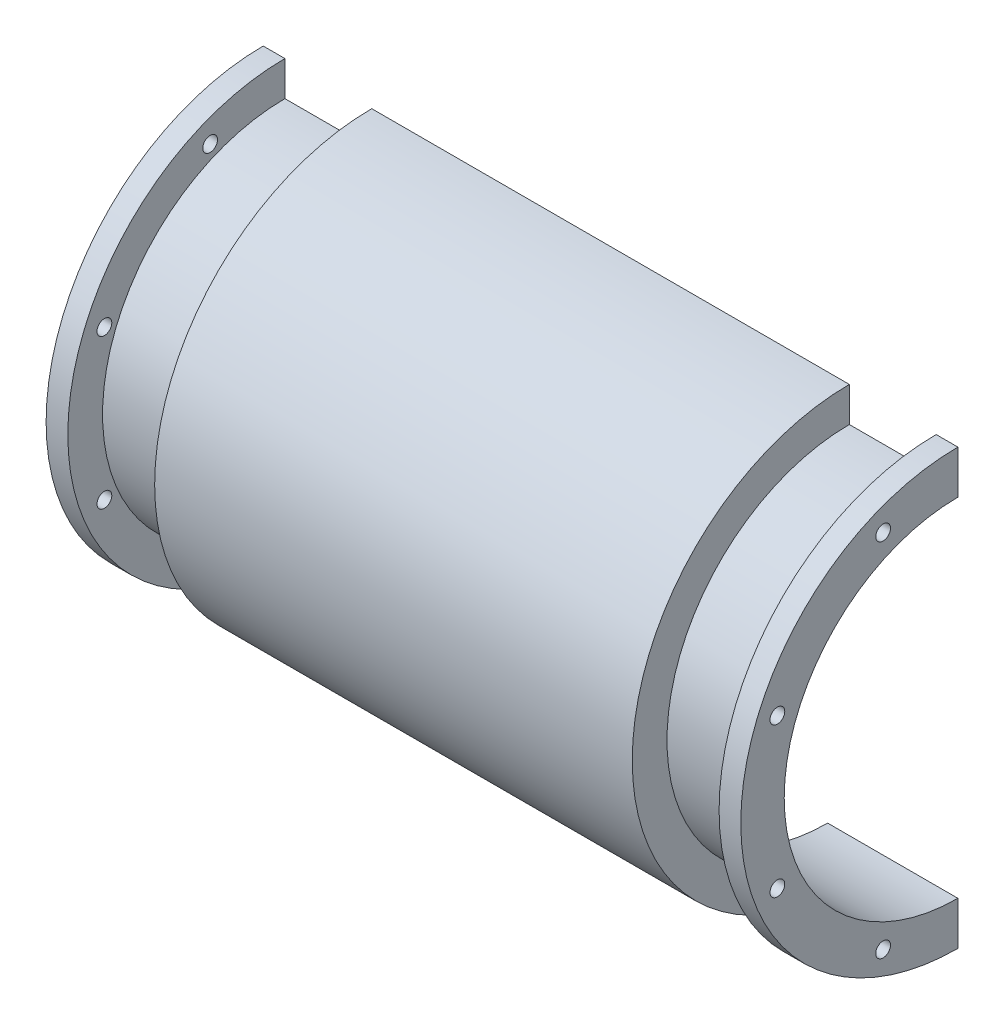
ISO-10303-21;
HEADER;
FILE_DESCRIPTION(('STEP AP214'),'2;1');
FILE_NAME('part.step','',(''),(''),'','','');
FILE_SCHEMA(('AUTOMOTIVE_DESIGN { 1 0 10303 214 1 1 1 1 }'));
ENDSEC;
DATA;
#1=APPLICATION_CONTEXT('core data for automotive mechanical design processes');
#2=APPLICATION_PROTOCOL_DEFINITION('international standard','automotive_design',2000,#1);
#3=PRODUCT_CONTEXT('',#1,'mechanical');
#4=PRODUCT('Part','Part','',(#3));
#5=PRODUCT_RELATED_PRODUCT_CATEGORY('part','',(#4));
#6=PRODUCT_DEFINITION_FORMATION('','',#4);
#7=PRODUCT_DEFINITION_CONTEXT('part definition',#1,'design');
#8=PRODUCT_DEFINITION('design','',#6,#7);
#9=PRODUCT_DEFINITION_SHAPE('','',#8);
#10=(LENGTH_UNIT() NAMED_UNIT(*) SI_UNIT(.MILLI.,.METRE.));
#11=(NAMED_UNIT(*) PLANE_ANGLE_UNIT() SI_UNIT($,.RADIAN.));
#12=(NAMED_UNIT(*) SI_UNIT($,.STERADIAN.) SOLID_ANGLE_UNIT());
#13=UNCERTAINTY_MEASURE_WITH_UNIT(LENGTH_MEASURE(1.E-05),#10,'distance_accuracy_value','');
#14=(GEOMETRIC_REPRESENTATION_CONTEXT(3) GLOBAL_UNCERTAINTY_ASSIGNED_CONTEXT((#13)) GLOBAL_UNIT_ASSIGNED_CONTEXT((#10,
#11,#12)) REPRESENTATION_CONTEXT('',''));
#15=CARTESIAN_POINT('',(0.,0.,0.));
#16=DIRECTION('',(0.,0.,1.));
#17=DIRECTION('',(1.,0.,0.));
#18=AXIS2_PLACEMENT_3D('',#15,#16,#17);
#19=CARTESIAN_POINT('',(80.,-40.,-2.79318507107451E-13));
#20=DIRECTION('',(-1.,0.,0.));
#21=DIRECTION('',(0.,-1.,0.));
#22=AXIS2_PLACEMENT_3D('',#19,#20,#21);
#23=PLANE('',#22);
#24=CARTESIAN_POINT('',(80.,41.5745789630079,17.2207544564291));
#25=DIRECTION('',(1.,0.,0.));
#26=DIRECTION('',(0.,0.,-1.));
#27=AXIS2_PLACEMENT_3D('',#24,#25,#26);
#28=CIRCLE('',#27,1.69999999999999);
#29=CARTESIAN_POINT('',(80.,41.5745789630079,15.5207544564291));
#30=VERTEX_POINT('',#29);
#31=EDGE_CURVE('E423',#30,#30,#28,.T.);
#32=ORIENTED_EDGE('',*,*,#31,.F.);
#33=EDGE_LOOP('',(#32));
#34=FACE_BOUND('',#33,.T.);
#35=CARTESIAN_POINT('',(80.,17.2207544564289,41.5745789630079));
#36=DIRECTION('',(1.,0.,0.));
#37=DIRECTION('',(0.,0.,-1.));
#38=AXIS2_PLACEMENT_3D('',#35,#36,#37);
#39=CIRCLE('',#38,1.69999999999999);
#40=CARTESIAN_POINT('',(80.,17.2207544564289,39.874578963008));
#41=VERTEX_POINT('',#40);
#42=EDGE_CURVE('E425',#41,#41,#39,.T.);
#43=ORIENTED_EDGE('',*,*,#42,.F.);
#44=EDGE_LOOP('',(#43));
#45=FACE_BOUND('',#44,.T.);
#46=CARTESIAN_POINT('',(80.,-41.574578963008,17.2207544564288));
#47=DIRECTION('',(1.,0.,0.));
#48=DIRECTION('',(0.,0.,-1.));
#49=AXIS2_PLACEMENT_3D('',#46,#47,#48);
#50=CIRCLE('',#49,1.69999999999999);
#51=CARTESIAN_POINT('',(80.,-41.574578963008,15.5207544564288));
#52=VERTEX_POINT('',#51);
#53=EDGE_CURVE('E439',#52,#52,#50,.T.);
#54=ORIENTED_EDGE('',*,*,#53,.F.);
#55=EDGE_LOOP('',(#54));
#56=FACE_BOUND('',#55,.T.);
#57=CARTESIAN_POINT('',(80.,0.,0.));
#58=DIRECTION('',(-1.,0.,0.));
#59=DIRECTION('',(0.,-1.,0.));
#60=AXIS2_PLACEMENT_3D('',#57,#58,#59);
#61=CIRCLE('',#60,50.);
#62=CARTESIAN_POINT('',(80.,-50.,-3.49148133884313E-13));
#63=VERTEX_POINT('',#62);
#64=CARTESIAN_POINT('',(80.,50.,0.));
#65=VERTEX_POINT('',#64);
#66=EDGE_CURVE('E274',#63,#65,#61,.T.);
#67=ORIENTED_EDGE('',*,*,#66,.F.);
#68=DIRECTION('',(0.,-1.,0.));
#69=VECTOR('',#68,1.);
#70=CARTESIAN_POINT('',(80.,-40.,-2.79318507107451E-13));
#71=LINE('',#70,#69);
#72=CARTESIAN_POINT('',(80.,-40.,-2.79318507107451E-13));
#73=VERTEX_POINT('',#72);
#74=EDGE_CURVE('E229',#73,#63,#71,.T.);
#75=ORIENTED_EDGE('',*,*,#74,.F.);
#76=CARTESIAN_POINT('',(80.,0.,0.));
#77=DIRECTION('',(-1.,0.,0.));
#78=DIRECTION('',(0.,-1.,0.));
#79=AXIS2_PLACEMENT_3D('',#76,#77,#78);
#80=CIRCLE('',#79,40.);
#81=CARTESIAN_POINT('',(80.,40.,0.));
#82=VERTEX_POINT('',#81);
#83=EDGE_CURVE('E276',#73,#82,#80,.T.);
#84=ORIENTED_EDGE('',*,*,#83,.T.);
#85=DIRECTION('',(0.,1.,0.));
#86=VECTOR('',#85,1.);
#87=CARTESIAN_POINT('',(80.,40.,0.));
#88=LINE('',#87,#86);
#89=EDGE_CURVE('E186',#82,#65,#88,.T.);
#90=ORIENTED_EDGE('',*,*,#89,.T.);
#91=EDGE_LOOP('',(#67,#75,#84,#90));
#92=FACE_BOUND('',#91,.T.);
#93=CARTESIAN_POINT('',(80.,-17.2207544564292,41.5745789630078));
#94=DIRECTION('',(1.,0.,0.));
#95=DIRECTION('',(0.,0.,-1.));
#96=AXIS2_PLACEMENT_3D('',#93,#94,#95);
#97=CIRCLE('',#96,1.69999999999999);
#98=CARTESIAN_POINT('',(80.,-17.2207544564292,39.8745789630078));
#99=VERTEX_POINT('',#98);
#100=EDGE_CURVE('E433',#99,#99,#97,.T.);
#101=ORIENTED_EDGE('',*,*,#100,.F.);
#102=EDGE_LOOP('',(#101));
#103=FACE_BOUND('',#102,.T.);
#104=ADVANCED_FACE('F39',(#34,#45,#56,#92,#103),#23,.F.);
#105=CARTESIAN_POINT('',(-80.,-50.,-3.49148133884313E-13));
#106=DIRECTION('',(1.,0.,0.));
#107=DIRECTION('',(0.,1.,0.));
#108=AXIS2_PLACEMENT_3D('',#105,#106,#107);
#109=PLANE('',#108);
#110=CARTESIAN_POINT('',(-80.,41.5745789630079,17.2207544564291));
#111=DIRECTION('',(-1.,0.,0.));
#112=DIRECTION('',(0.,0.,1.));
#113=AXIS2_PLACEMENT_3D('',#110,#111,#112);
#114=CIRCLE('',#113,1.69999999999999);
#115=CARTESIAN_POINT('',(-80.,41.5745789630079,18.9207544564291));
#116=VERTEX_POINT('',#115);
#117=EDGE_CURVE('E445',#116,#116,#114,.T.);
#118=ORIENTED_EDGE('',*,*,#117,.F.);
#119=EDGE_LOOP('',(#118));
#120=FACE_BOUND('',#119,.T.);
#121=CARTESIAN_POINT('',(-80.,-41.574578963008,17.2207544564288));
#122=DIRECTION('',(-1.,0.,0.));
#123=DIRECTION('',(0.,0.,1.));
#124=AXIS2_PLACEMENT_3D('',#121,#122,#123);
#125=CIRCLE('',#124,1.69999999999999);
#126=CARTESIAN_POINT('',(-80.,-41.574578963008,18.9207544564288));
#127=VERTEX_POINT('',#126);
#128=EDGE_CURVE('E463',#127,#127,#125,.T.);
#129=ORIENTED_EDGE('',*,*,#128,.F.);
#130=EDGE_LOOP('',(#129));
#131=FACE_BOUND('',#130,.T.);
#132=CARTESIAN_POINT('',(-80.,0.,0.));
#133=DIRECTION('',(-1.,0.,0.));
#134=DIRECTION('',(0.,-1.,0.));
#135=AXIS2_PLACEMENT_3D('',#132,#133,#134);
#136=CIRCLE('',#135,40.);
#137=CARTESIAN_POINT('',(-80.,-40.,-2.79318507107451E-13));
#138=VERTEX_POINT('',#137);
#139=CARTESIAN_POINT('',(-80.,40.,0.));
#140=VERTEX_POINT('',#139);
#141=EDGE_CURVE('E11',#138,#140,#136,.T.);
#142=ORIENTED_EDGE('',*,*,#141,.F.);
#143=DIRECTION('',(0.,1.,0.));
#144=VECTOR('',#143,1.);
#145=CARTESIAN_POINT('',(-80.,-50.,-3.49148133884313E-13));
#146=LINE('',#145,#144);
#147=CARTESIAN_POINT('',(-80.,-50.,-3.49148133884313E-13));
#148=VERTEX_POINT('',#147);
#149=EDGE_CURVE('E214',#148,#138,#146,.T.);
#150=ORIENTED_EDGE('',*,*,#149,.F.);
#151=CARTESIAN_POINT('',(-80.,0.,0.));
#152=DIRECTION('',(-1.,0.,0.));
#153=DIRECTION('',(0.,-1.,0.));
#154=AXIS2_PLACEMENT_3D('',#151,#152,#153);
#155=CIRCLE('',#154,50.);
#156=CARTESIAN_POINT('',(-80.,50.,0.));
#157=VERTEX_POINT('',#156);
#158=EDGE_CURVE('E54',#148,#157,#155,.T.);
#159=ORIENTED_EDGE('',*,*,#158,.T.);
#160=DIRECTION('',(0.,-1.,0.));
#161=VECTOR('',#160,1.);
#162=CARTESIAN_POINT('',(-80.,50.,0.));
#163=LINE('',#162,#161);
#164=EDGE_CURVE('E162',#157,#140,#163,.T.);
#165=ORIENTED_EDGE('',*,*,#164,.T.);
#166=EDGE_LOOP('',(#142,#150,#159,#165));
#167=FACE_BOUND('',#166,.T.);
#168=CARTESIAN_POINT('',(-80.,-17.2207544564292,41.5745789630078));
#169=DIRECTION('',(-1.,0.,0.));
#170=DIRECTION('',(0.,0.,1.));
#171=AXIS2_PLACEMENT_3D('',#168,#169,#170);
#172=CIRCLE('',#171,1.69999999999999);
#173=CARTESIAN_POINT('',(-80.,-17.2207544564292,43.2745789630078));
#174=VERTEX_POINT('',#173);
#175=EDGE_CURVE('E457',#174,#174,#172,.T.);
#176=ORIENTED_EDGE('',*,*,#175,.F.);
#177=EDGE_LOOP('',(#176));
#178=FACE_BOUND('',#177,.T.);
#179=CARTESIAN_POINT('',(-80.,17.2207544564289,41.5745789630079));
#180=DIRECTION('',(-1.,0.,0.));
#181=DIRECTION('',(0.,0.,1.));
#182=AXIS2_PLACEMENT_3D('',#179,#180,#181);
#183=CIRCLE('',#182,1.69999999999999);
#184=CARTESIAN_POINT('',(-80.,17.2207544564289,43.2745789630079));
#185=VERTEX_POINT('',#184);
#186=EDGE_CURVE('E451',#185,#185,#183,.T.);
#187=ORIENTED_EDGE('',*,*,#186,.F.);
#188=EDGE_LOOP('',(#187));
#189=FACE_BOUND('',#188,.T.);
#190=ADVANCED_FACE('F163',(#120,#131,#167,#178,#189),#109,.F.);
#191=CARTESIAN_POINT('',(-50.,0.,0.));
#192=DIRECTION('',(-1.,0.,0.));
#193=DIRECTION('',(0.,-1.,0.));
#194=AXIS2_PLACEMENT_3D('',#191,#192,#193);
#195=CYLINDRICAL_SURFACE('',#194,40.);
#196=CARTESIAN_POINT('',(-50.,0.,0.));
#197=DIRECTION('',(-1.,0.,0.));
#198=DIRECTION('',(0.,-1.,0.));
#199=AXIS2_PLACEMENT_3D('',#196,#197,#198);
#200=CIRCLE('',#199,40.);
#201=CARTESIAN_POINT('',(-50.,-40.,-2.79318507107451E-13));
#202=VERTEX_POINT('',#201);
#203=CARTESIAN_POINT('',(-50.,40.,0.));
#204=VERTEX_POINT('',#203);
#205=EDGE_CURVE('E47',#202,#204,#200,.T.);
#206=ORIENTED_EDGE('',*,*,#205,.F.);
#207=DIRECTION('',(1.,0.,0.));
#208=VECTOR('',#207,1.);
#209=CARTESIAN_POINT('',(-80.,-40.,-2.79318507107451E-13));
#210=LINE('',#209,#208);
#211=EDGE_CURVE('E158',#138,#202,#210,.T.);
#212=ORIENTED_EDGE('',*,*,#211,.F.);
#213=ORIENTED_EDGE('',*,*,#141,.T.);
#214=DIRECTION('',(1.,0.,0.));
#215=VECTOR('',#214,1.);
#216=CARTESIAN_POINT('',(-80.,40.,0.));
#217=LINE('',#216,#215);
#218=EDGE_CURVE('E155',#140,#204,#217,.T.);
#219=ORIENTED_EDGE('',*,*,#218,.T.);
#220=EDGE_LOOP('',(#206,#212,#213,#219));
#221=FACE_BOUND('',#220,.T.);
#222=ADVANCED_FACE('F41',(#221),#195,.F.);
#223=CARTESIAN_POINT('',(-50.,-40.,-2.79318507107451E-13));
#224=DIRECTION('',(-1.,0.,0.));
#225=DIRECTION('',(0.,-1.,0.));
#226=AXIS2_PLACEMENT_3D('',#223,#224,#225);
#227=PLANE('',#226);
#228=CARTESIAN_POINT('',(-50.,0.,0.));
#229=DIRECTION('',(-1.,0.,0.));
#230=DIRECTION('',(0.,-1.,0.));
#231=AXIS2_PLACEMENT_3D('',#228,#229,#230);
#232=CIRCLE('',#231,49.);
#233=CARTESIAN_POINT('',(-50.,-49.,-3.42165171206627E-13));
#234=VERTEX_POINT('',#233);
#235=CARTESIAN_POINT('',(-50.,49.,0.));
#236=VERTEX_POINT('',#235);
#237=EDGE_CURVE('E282',#234,#236,#232,.T.);
#238=ORIENTED_EDGE('',*,*,#237,.F.);
#239=DIRECTION('',(0.,-1.,0.));
#240=VECTOR('',#239,1.);
#241=CARTESIAN_POINT('',(-50.,-40.,-2.79318507107451E-13));
#242=LINE('',#241,#240);
#243=EDGE_CURVE('E217',#202,#234,#242,.T.);
#244=ORIENTED_EDGE('',*,*,#243,.F.);
#245=ORIENTED_EDGE('',*,*,#205,.T.);
#246=DIRECTION('',(0.,1.,0.));
#247=VECTOR('',#246,1.);
#248=CARTESIAN_POINT('',(-50.,40.,0.));
#249=LINE('',#248,#247);
#250=EDGE_CURVE('E172',#204,#236,#249,.T.);
#251=ORIENTED_EDGE('',*,*,#250,.T.);
#252=EDGE_LOOP('',(#238,#244,#245,#251));
#253=FACE_BOUND('',#252,.T.);
#254=ADVANCED_FACE('F285',(#253),#227,.F.);
#255=CARTESIAN_POINT('',(-50.,0.,0.));
#256=DIRECTION('',(-1.,0.,0.));
#257=DIRECTION('',(0.,-1.,0.));
#258=AXIS2_PLACEMENT_3D('',#255,#256,#257);
#259=CYLINDRICAL_SURFACE('',#258,49.);
#260=CARTESIAN_POINT('',(50.,0.,0.));
#261=DIRECTION('',(-1.,0.,0.));
#262=DIRECTION('',(0.,-1.,0.));
#263=AXIS2_PLACEMENT_3D('',#260,#261,#262);
#264=CIRCLE('',#263,49.);
#265=CARTESIAN_POINT('',(50.,-49.,-3.42165171206627E-13));
#266=VERTEX_POINT('',#265);
#267=CARTESIAN_POINT('',(50.,49.,0.));
#268=VERTEX_POINT('',#267);
#269=EDGE_CURVE('E280',#266,#268,#264,.T.);
#270=ORIENTED_EDGE('',*,*,#269,.F.);
#271=DIRECTION('',(1.,0.,0.));
#272=VECTOR('',#271,1.);
#273=CARTESIAN_POINT('',(-50.,-49.,-3.42165171206627E-13));
#274=LINE('',#273,#272);
#275=EDGE_CURVE('E220',#234,#266,#274,.T.);
#276=ORIENTED_EDGE('',*,*,#275,.F.);
#277=ORIENTED_EDGE('',*,*,#237,.T.);
#278=DIRECTION('',(1.,0.,0.));
#279=VECTOR('',#278,1.);
#280=CARTESIAN_POINT('',(-50.,49.,0.));
#281=LINE('',#280,#279);
#282=EDGE_CURVE('E174',#236,#268,#281,.T.);
#283=ORIENTED_EDGE('',*,*,#282,.T.);
#284=EDGE_LOOP('',(#270,#276,#277,#283));
#285=FACE_BOUND('',#284,.T.);
#286=ADVANCED_FACE('F333',(#285),#259,.F.);
#287=CARTESIAN_POINT('',(50.,-49.,-3.42165171206627E-13));
#288=DIRECTION('',(1.,0.,0.));
#289=DIRECTION('',(0.,1.,0.));
#290=AXIS2_PLACEMENT_3D('',#287,#288,#289);
#291=PLANE('',#290);
#292=CARTESIAN_POINT('',(50.,0.,0.));
#293=DIRECTION('',(-1.,0.,0.));
#294=DIRECTION('',(0.,-1.,0.));
#295=AXIS2_PLACEMENT_3D('',#292,#293,#294);
#296=CIRCLE('',#295,40.);
#297=CARTESIAN_POINT('',(50.,-40.,-2.79318507107451E-13));
#298=VERTEX_POINT('',#297);
#299=CARTESIAN_POINT('',(50.,40.,0.));
#300=VERTEX_POINT('',#299);
#301=EDGE_CURVE('E278',#298,#300,#296,.T.);
#302=ORIENTED_EDGE('',*,*,#301,.F.);
#303=DIRECTION('',(0.,1.,0.));
#304=VECTOR('',#303,1.);
#305=CARTESIAN_POINT('',(50.,-49.,-3.42165171206627E-13));
#306=LINE('',#305,#304);
#307=EDGE_CURVE('E223',#266,#298,#306,.T.);
#308=ORIENTED_EDGE('',*,*,#307,.F.);
#309=ORIENTED_EDGE('',*,*,#269,.T.);
#310=DIRECTION('',(0.,-1.,0.));
#311=VECTOR('',#310,1.);
#312=CARTESIAN_POINT('',(50.,49.,0.));
#313=LINE('',#312,#311);
#314=EDGE_CURVE('E180',#268,#300,#313,.T.);
#315=ORIENTED_EDGE('',*,*,#314,.T.);
#316=EDGE_LOOP('',(#302,#308,#309,#315));
#317=FACE_BOUND('',#316,.T.);
#318=ADVANCED_FACE('F330',(#317),#291,.F.);
#319=CARTESIAN_POINT('',(-50.,0.,0.));
#320=DIRECTION('',(-1.,0.,0.));
#321=DIRECTION('',(0.,-1.,0.));
#322=AXIS2_PLACEMENT_3D('',#319,#320,#321);
#323=CYLINDRICAL_SURFACE('',#322,40.);
#324=ORIENTED_EDGE('',*,*,#83,.F.);
#325=DIRECTION('',(1.,0.,0.));
#326=VECTOR('',#325,1.);
#327=CARTESIAN_POINT('',(50.,-40.,-2.79318507107451E-13));
#328=LINE('',#327,#326);
#329=EDGE_CURVE('E226',#298,#73,#328,.T.);
#330=ORIENTED_EDGE('',*,*,#329,.F.);
#331=ORIENTED_EDGE('',*,*,#301,.T.);
#332=DIRECTION('',(1.,0.,0.));
#333=VECTOR('',#332,1.);
#334=CARTESIAN_POINT('',(50.,40.,0.));
#335=LINE('',#334,#333);
#336=EDGE_CURVE('E183',#300,#82,#335,.T.);
#337=ORIENTED_EDGE('',*,*,#336,.T.);
#338=EDGE_LOOP('',(#324,#330,#331,#337));
#339=FACE_BOUND('',#338,.T.);
#340=ADVANCED_FACE('F327',(#339),#323,.F.);
#341=CARTESIAN_POINT('',(-50.,0.,0.));
#342=DIRECTION('',(-1.,0.,0.));
#343=DIRECTION('',(0.,-1.,0.));
#344=AXIS2_PLACEMENT_3D('',#341,#342,#343);
#345=CYLINDRICAL_SURFACE('',#344,50.);
#346=CARTESIAN_POINT('',(75.,0.,0.));
#347=DIRECTION('',(-1.,0.,0.));
#348=DIRECTION('',(0.,-1.,0.));
#349=AXIS2_PLACEMENT_3D('',#346,#347,#348);
#350=CIRCLE('',#349,50.);
#351=CARTESIAN_POINT('',(75.,-50.,-3.49148133884313E-13));
#352=VERTEX_POINT('',#351);
#353=CARTESIAN_POINT('',(75.,50.,0.));
#354=VERTEX_POINT('',#353);
#355=EDGE_CURVE('E272',#352,#354,#350,.T.);
#356=ORIENTED_EDGE('',*,*,#355,.F.);
#357=DIRECTION('',(-1.,0.,0.));
#358=VECTOR('',#357,1.);
#359=CARTESIAN_POINT('',(80.,-50.,-3.49148133884313E-13));
#360=LINE('',#359,#358);
#361=EDGE_CURVE('E232',#63,#352,#360,.T.);
#362=ORIENTED_EDGE('',*,*,#361,.F.);
#363=ORIENTED_EDGE('',*,*,#66,.T.);
#364=DIRECTION('',(-1.,0.,0.));
#365=VECTOR('',#364,1.);
#366=CARTESIAN_POINT('',(80.,50.,0.));
#367=LINE('',#366,#365);
#368=EDGE_CURVE('E189',#65,#354,#367,.T.);
#369=ORIENTED_EDGE('',*,*,#368,.T.);
#370=EDGE_LOOP('',(#356,#362,#363,#369));
#371=FACE_BOUND('',#370,.T.);
#372=ADVANCED_FACE('F320',(#371),#345,.T.);
#373=CARTESIAN_POINT('',(75.,-50.,-3.49148133884313E-13));
#374=DIRECTION('',(1.,0.,0.));
#375=DIRECTION('',(0.,1.,0.));
#376=AXIS2_PLACEMENT_3D('',#373,#374,#375);
#377=PLANE('',#376);
#378=CARTESIAN_POINT('',(75.,41.5745789630079,17.2207544564291));
#379=DIRECTION('',(1.,0.,0.));
#380=DIRECTION('',(0.,1.,0.));
#381=AXIS2_PLACEMENT_3D('',#378,#379,#380);
#382=CIRCLE('',#381,1.69999999999999);
#383=CARTESIAN_POINT('',(75.,43.2745789630079,17.2207544564291));
#384=VERTEX_POINT('',#383);
#385=EDGE_CURVE('E421',#384,#384,#382,.T.);
#386=ORIENTED_EDGE('',*,*,#385,.T.);
#387=EDGE_LOOP('',(#386));
#388=FACE_BOUND('',#387,.T.);
#389=CARTESIAN_POINT('',(75.,17.2207544564289,41.5745789630079));
#390=DIRECTION('',(1.,0.,0.));
#391=DIRECTION('',(0.,1.,0.));
#392=AXIS2_PLACEMENT_3D('',#389,#390,#391);
#393=CIRCLE('',#392,1.69999999999999);
#394=CARTESIAN_POINT('',(75.,18.9207544564289,41.5745789630079));
#395=VERTEX_POINT('',#394);
#396=EDGE_CURVE('E430',#395,#395,#393,.T.);
#397=ORIENTED_EDGE('',*,*,#396,.T.);
#398=EDGE_LOOP('',(#397));
#399=FACE_BOUND('',#398,.T.);
#400=CARTESIAN_POINT('',(75.,-17.2207544564292,41.5745789630078));
#401=DIRECTION('',(1.,0.,0.));
#402=DIRECTION('',(0.,1.,0.));
#403=AXIS2_PLACEMENT_3D('',#400,#401,#402);
#404=CIRCLE('',#403,1.69999999999999);
#405=CARTESIAN_POINT('',(75.,-15.5207544564292,41.5745789630078));
#406=VERTEX_POINT('',#405);
#407=EDGE_CURVE('E436',#406,#406,#404,.T.);
#408=ORIENTED_EDGE('',*,*,#407,.T.);
#409=EDGE_LOOP('',(#408));
#410=FACE_BOUND('',#409,.T.);
#411=CARTESIAN_POINT('',(75.,-41.574578963008,17.2207544564288));
#412=DIRECTION('',(1.,0.,0.));
#413=DIRECTION('',(0.,1.,0.));
#414=AXIS2_PLACEMENT_3D('',#411,#412,#413);
#415=CIRCLE('',#414,1.69999999999999);
#416=CARTESIAN_POINT('',(75.,-39.874578963008,17.2207544564288));
#417=VERTEX_POINT('',#416);
#418=EDGE_CURVE('E442',#417,#417,#415,.T.);
#419=ORIENTED_EDGE('',*,*,#418,.T.);
#420=EDGE_LOOP('',(#419));
#421=FACE_BOUND('',#420,.T.);
#422=CARTESIAN_POINT('',(75.,0.,0.));
#423=DIRECTION('',(-1.,0.,0.));
#424=DIRECTION('',(0.,-1.,0.));
#425=AXIS2_PLACEMENT_3D('',#422,#423,#424);
#426=CIRCLE('',#425,42.);
#427=CARTESIAN_POINT('',(75.,-42.,-2.93284432462823E-13));
#428=VERTEX_POINT('',#427);
#429=CARTESIAN_POINT('',(75.,42.,0.));
#430=VERTEX_POINT('',#429);
#431=EDGE_CURVE('E270',#428,#430,#426,.T.);
#432=ORIENTED_EDGE('',*,*,#431,.F.);
#433=DIRECTION('',(0.,1.,0.));
#434=VECTOR('',#433,1.);
#435=CARTESIAN_POINT('',(75.,-50.,-3.49148133884313E-13));
#436=LINE('',#435,#434);
#437=EDGE_CURVE('E235',#352,#428,#436,.T.);
#438=ORIENTED_EDGE('',*,*,#437,.F.);
#439=ORIENTED_EDGE('',*,*,#355,.T.);
#440=DIRECTION('',(0.,-1.,0.));
#441=VECTOR('',#440,1.);
#442=CARTESIAN_POINT('',(75.,50.,0.));
#443=LINE('',#442,#441);
#444=EDGE_CURVE('E192',#354,#430,#443,.T.);
#445=ORIENTED_EDGE('',*,*,#444,.T.);
#446=EDGE_LOOP('',(#432,#438,#439,#445));
#447=FACE_BOUND('',#446,.T.);
#448=ADVANCED_FACE('F315',(#388,#399,#410,#421,#447),#377,.F.);
#449=CARTESIAN_POINT('',(-50.,0.,0.));
#450=DIRECTION('',(-1.,0.,0.));
#451=DIRECTION('',(0.,-1.,0.));
#452=AXIS2_PLACEMENT_3D('',#449,#450,#451);
#453=CYLINDRICAL_SURFACE('',#452,42.);
#454=CARTESIAN_POINT('',(55.,0.,0.));
#455=DIRECTION('',(-1.,0.,0.));
#456=DIRECTION('',(0.,-1.,0.));
#457=AXIS2_PLACEMENT_3D('',#454,#455,#456);
#458=CIRCLE('',#457,42.);
#459=CARTESIAN_POINT('',(55.,-42.,-2.93284432462823E-13));
#460=VERTEX_POINT('',#459);
#461=CARTESIAN_POINT('',(55.,42.,0.));
#462=VERTEX_POINT('',#461);
#463=EDGE_CURVE('E268',#460,#462,#458,.T.);
#464=ORIENTED_EDGE('',*,*,#463,.F.);
#465=DIRECTION('',(-1.,0.,0.));
#466=VECTOR('',#465,1.);
#467=CARTESIAN_POINT('',(75.,-42.,-2.93284432462823E-13));
#468=LINE('',#467,#466);
#469=EDGE_CURVE('E238',#428,#460,#468,.T.);
#470=ORIENTED_EDGE('',*,*,#469,.F.);
#471=ORIENTED_EDGE('',*,*,#431,.T.);
#472=DIRECTION('',(-1.,0.,0.));
#473=VECTOR('',#472,1.);
#474=CARTESIAN_POINT('',(75.,42.,0.));
#475=LINE('',#474,#473);
#476=EDGE_CURVE('E195',#430,#462,#475,.T.);
#477=ORIENTED_EDGE('',*,*,#476,.T.);
#478=EDGE_LOOP('',(#464,#470,#471,#477));
#479=FACE_BOUND('',#478,.T.);
#480=ADVANCED_FACE('F312',(#479),#453,.T.);
#481=CARTESIAN_POINT('',(55.,-42.,-2.93284432462823E-13));
#482=DIRECTION('',(-1.,0.,0.));
#483=DIRECTION('',(0.,-1.,0.));
#484=AXIS2_PLACEMENT_3D('',#481,#482,#483);
#485=PLANE('',#484);
#486=CARTESIAN_POINT('',(55.,0.,0.));
#487=DIRECTION('',(-1.,0.,0.));
#488=DIRECTION('',(0.,-1.,0.));
#489=AXIS2_PLACEMENT_3D('',#486,#487,#488);
#490=CIRCLE('',#489,50.);
#491=CARTESIAN_POINT('',(55.,-50.,-3.49148133884313E-13));
#492=VERTEX_POINT('',#491);
#493=CARTESIAN_POINT('',(55.,50.,0.));
#494=VERTEX_POINT('',#493);
#495=EDGE_CURVE('E266',#492,#494,#490,.T.);
#496=ORIENTED_EDGE('',*,*,#495,.F.);
#497=DIRECTION('',(0.,-1.,0.));
#498=VECTOR('',#497,1.);
#499=CARTESIAN_POINT('',(55.,-42.,-2.93284432462823E-13));
#500=LINE('',#499,#498);
#501=EDGE_CURVE('E241',#460,#492,#500,.T.);
#502=ORIENTED_EDGE('',*,*,#501,.F.);
#503=ORIENTED_EDGE('',*,*,#463,.T.);
#504=DIRECTION('',(0.,1.,0.));
#505=VECTOR('',#504,1.);
#506=CARTESIAN_POINT('',(55.,42.,0.));
#507=LINE('',#506,#505);
#508=EDGE_CURVE('E198',#462,#494,#507,.T.);
#509=ORIENTED_EDGE('',*,*,#508,.T.);
#510=EDGE_LOOP('',(#496,#502,#503,#509));
#511=FACE_BOUND('',#510,.T.);
#512=ADVANCED_FACE('F308',(#511),#485,.F.);
#513=CARTESIAN_POINT('',(-50.,0.,0.));
#514=DIRECTION('',(-1.,0.,0.));
#515=DIRECTION('',(0.,-1.,0.));
#516=AXIS2_PLACEMENT_3D('',#513,#514,#515);
#517=CYLINDRICAL_SURFACE('',#516,50.);
#518=CARTESIAN_POINT('',(-55.,0.,0.));
#519=DIRECTION('',(-1.,0.,0.));
#520=DIRECTION('',(0.,-1.,0.));
#521=AXIS2_PLACEMENT_3D('',#518,#519,#520);
#522=CIRCLE('',#521,50.);
#523=CARTESIAN_POINT('',(-55.,-50.,-3.49148133884313E-13));
#524=VERTEX_POINT('',#523);
#525=CARTESIAN_POINT('',(-55.,50.,0.));
#526=VERTEX_POINT('',#525);
#527=EDGE_CURVE('E264',#524,#526,#522,.T.);
#528=ORIENTED_EDGE('',*,*,#527,.F.);
#529=DIRECTION('',(-1.,0.,0.));
#530=VECTOR('',#529,1.);
#531=CARTESIAN_POINT('',(55.,-50.,-3.49148133884313E-13));
#532=LINE('',#531,#530);
#533=EDGE_CURVE('E244',#492,#524,#532,.T.);
#534=ORIENTED_EDGE('',*,*,#533,.F.);
#535=ORIENTED_EDGE('',*,*,#495,.T.);
#536=DIRECTION('',(-1.,0.,0.));
#537=VECTOR('',#536,1.);
#538=CARTESIAN_POINT('',(55.,50.,0.));
#539=LINE('',#538,#537);
#540=EDGE_CURVE('E201',#494,#526,#539,.T.);
#541=ORIENTED_EDGE('',*,*,#540,.T.);
#542=EDGE_LOOP('',(#528,#534,#535,#541));
#543=FACE_BOUND('',#542,.T.);
#544=ADVANCED_FACE('F303',(#543),#517,.T.);
#545=CARTESIAN_POINT('',(-55.,-50.,-3.49148133884313E-13));
#546=DIRECTION('',(1.,0.,0.));
#547=DIRECTION('',(0.,1.,0.));
#548=AXIS2_PLACEMENT_3D('',#545,#546,#547);
#549=PLANE('',#548);
#550=CARTESIAN_POINT('',(-55.,0.,0.));
#551=DIRECTION('',(-1.,0.,0.));
#552=DIRECTION('',(0.,-1.,0.));
#553=AXIS2_PLACEMENT_3D('',#550,#551,#552);
#554=CIRCLE('',#553,42.);
#555=CARTESIAN_POINT('',(-55.,-42.,-2.93284432462823E-13));
#556=VERTEX_POINT('',#555);
#557=CARTESIAN_POINT('',(-55.,42.,0.));
#558=VERTEX_POINT('',#557);
#559=EDGE_CURVE('E262',#556,#558,#554,.T.);
#560=ORIENTED_EDGE('',*,*,#559,.F.);
#561=DIRECTION('',(0.,1.,0.));
#562=VECTOR('',#561,1.);
#563=CARTESIAN_POINT('',(-55.,-50.,-3.49148133884313E-13));
#564=LINE('',#563,#562);
#565=EDGE_CURVE('E247',#524,#556,#564,.T.);
#566=ORIENTED_EDGE('',*,*,#565,.F.);
#567=ORIENTED_EDGE('',*,*,#527,.T.);
#568=DIRECTION('',(0.,-1.,0.));
#569=VECTOR('',#568,1.);
#570=CARTESIAN_POINT('',(-55.,50.,0.));
#571=LINE('',#570,#569);
#572=EDGE_CURVE('E204',#526,#558,#571,.T.);
#573=ORIENTED_EDGE('',*,*,#572,.T.);
#574=EDGE_LOOP('',(#560,#566,#567,#573));
#575=FACE_BOUND('',#574,.T.);
#576=ADVANCED_FACE('F300',(#575),#549,.F.);
#577=CARTESIAN_POINT('',(-50.,0.,0.));
#578=DIRECTION('',(-1.,0.,0.));
#579=DIRECTION('',(0.,-1.,0.));
#580=AXIS2_PLACEMENT_3D('',#577,#578,#579);
#581=CYLINDRICAL_SURFACE('',#580,42.);
#582=CARTESIAN_POINT('',(-75.,0.,0.));
#583=DIRECTION('',(-1.,0.,0.));
#584=DIRECTION('',(0.,-1.,0.));
#585=AXIS2_PLACEMENT_3D('',#582,#583,#584);
#586=CIRCLE('',#585,42.);
#587=CARTESIAN_POINT('',(-75.,-42.,-2.93284432462823E-13));
#588=VERTEX_POINT('',#587);
#589=CARTESIAN_POINT('',(-75.,42.,0.));
#590=VERTEX_POINT('',#589);
#591=EDGE_CURVE('E260',#588,#590,#586,.T.);
#592=ORIENTED_EDGE('',*,*,#591,.F.);
#593=DIRECTION('',(-1.,0.,0.));
#594=VECTOR('',#593,1.);
#595=CARTESIAN_POINT('',(-55.,-42.,-2.93284432462823E-13));
#596=LINE('',#595,#594);
#597=EDGE_CURVE('E250',#556,#588,#596,.T.);
#598=ORIENTED_EDGE('',*,*,#597,.F.);
#599=ORIENTED_EDGE('',*,*,#559,.T.);
#600=DIRECTION('',(-1.,0.,0.));
#601=VECTOR('',#600,1.);
#602=CARTESIAN_POINT('',(-55.,42.,0.));
#603=LINE('',#602,#601);
#604=EDGE_CURVE('E207',#558,#590,#603,.T.);
#605=ORIENTED_EDGE('',*,*,#604,.T.);
#606=EDGE_LOOP('',(#592,#598,#599,#605));
#607=FACE_BOUND('',#606,.T.);
#608=ADVANCED_FACE('F296',(#607),#581,.T.);
#609=CARTESIAN_POINT('',(-75.,-42.,-2.93284432462823E-13));
#610=DIRECTION('',(-1.,0.,0.));
#611=DIRECTION('',(0.,-1.,0.));
#612=AXIS2_PLACEMENT_3D('',#609,#610,#611);
#613=PLANE('',#612);
#614=CARTESIAN_POINT('',(-75.,41.5745789630079,17.2207544564291));
#615=DIRECTION('',(-1.,0.,0.));
#616=DIRECTION('',(0.,-1.,0.));
#617=AXIS2_PLACEMENT_3D('',#614,#615,#616);
#618=CIRCLE('',#617,1.69999999999999);
#619=CARTESIAN_POINT('',(-75.,39.8745789630079,17.2207544564291));
#620=VERTEX_POINT('',#619);
#621=EDGE_CURVE('E448',#620,#620,#618,.T.);
#622=ORIENTED_EDGE('',*,*,#621,.T.);
#623=EDGE_LOOP('',(#622));
#624=FACE_BOUND('',#623,.T.);
#625=CARTESIAN_POINT('',(-75.,17.2207544564289,41.5745789630079));
#626=DIRECTION('',(-1.,0.,0.));
#627=DIRECTION('',(0.,-1.,0.));
#628=AXIS2_PLACEMENT_3D('',#625,#626,#627);
#629=CIRCLE('',#628,1.69999999999999);
#630=CARTESIAN_POINT('',(-75.,15.5207544564289,41.5745789630079));
#631=VERTEX_POINT('',#630);
#632=EDGE_CURVE('E454',#631,#631,#629,.T.);
#633=ORIENTED_EDGE('',*,*,#632,.T.);
#634=EDGE_LOOP('',(#633));
#635=FACE_BOUND('',#634,.T.);
#636=CARTESIAN_POINT('',(-75.,-17.2207544564292,41.5745789630078));
#637=DIRECTION('',(-1.,0.,0.));
#638=DIRECTION('',(0.,-1.,0.));
#639=AXIS2_PLACEMENT_3D('',#636,#637,#638);
#640=CIRCLE('',#639,1.69999999999999);
#641=CARTESIAN_POINT('',(-75.,-18.9207544564292,41.5745789630078));
#642=VERTEX_POINT('',#641);
#643=EDGE_CURVE('E460',#642,#642,#640,.T.);
#644=ORIENTED_EDGE('',*,*,#643,.T.);
#645=EDGE_LOOP('',(#644));
#646=FACE_BOUND('',#645,.T.);
#647=CARTESIAN_POINT('',(-75.,-41.574578963008,17.2207544564288));
#648=DIRECTION('',(-1.,0.,0.));
#649=DIRECTION('',(0.,-1.,0.));
#650=AXIS2_PLACEMENT_3D('',#647,#648,#649);
#651=CIRCLE('',#650,1.69999999999999);
#652=CARTESIAN_POINT('',(-75.,-43.274578963008,17.2207544564288));
#653=VERTEX_POINT('',#652);
#654=EDGE_CURVE('E167',#653,#653,#651,.T.);
#655=ORIENTED_EDGE('',*,*,#654,.T.);
#656=EDGE_LOOP('',(#655));
#657=FACE_BOUND('',#656,.T.);
#658=CARTESIAN_POINT('',(-75.,0.,0.));
#659=DIRECTION('',(-1.,0.,0.));
#660=DIRECTION('',(0.,-1.,0.));
#661=AXIS2_PLACEMENT_3D('',#658,#659,#660);
#662=CIRCLE('',#661,50.);
#663=CARTESIAN_POINT('',(-75.,-50.,-3.49148133884313E-13));
#664=VERTEX_POINT('',#663);
#665=CARTESIAN_POINT('',(-75.,50.,0.));
#666=VERTEX_POINT('',#665);
#667=EDGE_CURVE('E62',#664,#666,#662,.T.);
#668=ORIENTED_EDGE('',*,*,#667,.F.);
#669=DIRECTION('',(0.,-1.,0.));
#670=VECTOR('',#669,1.);
#671=CARTESIAN_POINT('',(-75.,-42.,-2.93284432462823E-13));
#672=LINE('',#671,#670);
#673=EDGE_CURVE('E253',#588,#664,#672,.T.);
#674=ORIENTED_EDGE('',*,*,#673,.F.);
#675=ORIENTED_EDGE('',*,*,#591,.T.);
#676=DIRECTION('',(0.,1.,0.));
#677=VECTOR('',#676,1.);
#678=CARTESIAN_POINT('',(-75.,42.,0.));
#679=LINE('',#678,#677);
#680=EDGE_CURVE('E210',#590,#666,#679,.T.);
#681=ORIENTED_EDGE('',*,*,#680,.T.);
#682=EDGE_LOOP('',(#668,#674,#675,#681));
#683=FACE_BOUND('',#682,.T.);
#684=ADVANCED_FACE('F291',(#624,#635,#646,#657,#683),#613,.F.);
#685=CARTESIAN_POINT('',(-50.,0.,0.));
#686=DIRECTION('',(-1.,0.,0.));
#687=DIRECTION('',(0.,-1.,0.));
#688=AXIS2_PLACEMENT_3D('',#685,#686,#687);
#689=CYLINDRICAL_SURFACE('',#688,50.);
#690=DIRECTION('',(-1.,0.,0.));
#691=VECTOR('',#690,1.);
#692=CARTESIAN_POINT('',(-75.,-50.,-3.49148133884313E-13));
#693=LINE('',#692,#691);
#694=EDGE_CURVE('E255',#664,#148,#693,.T.);
#695=ORIENTED_EDGE('',*,*,#694,.F.);
#696=ORIENTED_EDGE('',*,*,#667,.T.);
#697=DIRECTION('',(-1.,0.,0.));
#698=VECTOR('',#697,1.);
#699=CARTESIAN_POINT('',(-75.,50.,0.));
#700=LINE('',#699,#698);
#701=EDGE_CURVE('E212',#666,#157,#700,.T.);
#702=ORIENTED_EDGE('',*,*,#701,.T.);
#703=ORIENTED_EDGE('',*,*,#158,.F.);
#704=EDGE_LOOP('',(#695,#696,#702,#703));
#705=FACE_BOUND('',#704,.T.);
#706=ADVANCED_FACE('F289',(#705),#689,.T.);
#707=CARTESIAN_POINT('',(0.,0.,0.));
#708=DIRECTION('',(0.,0.,-1.));
#709=DIRECTION('',(1.,0.,0.));
#710=AXIS2_PLACEMENT_3D('',#707,#708,#709);
#711=PLANE('',#710);
#712=ORIENTED_EDGE('',*,*,#149,.T.);
#713=ORIENTED_EDGE('',*,*,#211,.T.);
#714=ORIENTED_EDGE('',*,*,#243,.T.);
#715=ORIENTED_EDGE('',*,*,#275,.T.);
#716=ORIENTED_EDGE('',*,*,#307,.T.);
#717=ORIENTED_EDGE('',*,*,#329,.T.);
#718=ORIENTED_EDGE('',*,*,#74,.T.);
#719=ORIENTED_EDGE('',*,*,#361,.T.);
#720=ORIENTED_EDGE('',*,*,#437,.T.);
#721=ORIENTED_EDGE('',*,*,#469,.T.);
#722=ORIENTED_EDGE('',*,*,#501,.T.);
#723=ORIENTED_EDGE('',*,*,#533,.T.);
#724=ORIENTED_EDGE('',*,*,#565,.T.);
#725=ORIENTED_EDGE('',*,*,#597,.T.);
#726=ORIENTED_EDGE('',*,*,#673,.T.);
#727=ORIENTED_EDGE('',*,*,#694,.T.);
#728=EDGE_LOOP('',(#712,#713,#714,#715,#716,#717,#718,#719,#720,#721,#722,#723,#724,#725,#726,#727));
#729=FACE_BOUND('',#728,.T.);
#730=ADVANCED_FACE('F287',(#729),#711,.T.);
#731=CARTESIAN_POINT('',(0.,0.,0.));
#732=DIRECTION('',(0.,0.,1.));
#733=DIRECTION('',(1.,0.,0.));
#734=AXIS2_PLACEMENT_3D('',#731,#732,#733);
#735=PLANE('',#734);
#736=ORIENTED_EDGE('',*,*,#164,.F.);
#737=ORIENTED_EDGE('',*,*,#701,.F.);
#738=ORIENTED_EDGE('',*,*,#680,.F.);
#739=ORIENTED_EDGE('',*,*,#604,.F.);
#740=ORIENTED_EDGE('',*,*,#572,.F.);
#741=ORIENTED_EDGE('',*,*,#540,.F.);
#742=ORIENTED_EDGE('',*,*,#508,.F.);
#743=ORIENTED_EDGE('',*,*,#476,.F.);
#744=ORIENTED_EDGE('',*,*,#444,.F.);
#745=ORIENTED_EDGE('',*,*,#368,.F.);
#746=ORIENTED_EDGE('',*,*,#89,.F.);
#747=ORIENTED_EDGE('',*,*,#336,.F.);
#748=ORIENTED_EDGE('',*,*,#314,.F.);
#749=ORIENTED_EDGE('',*,*,#282,.F.);
#750=ORIENTED_EDGE('',*,*,#250,.F.);
#751=ORIENTED_EDGE('',*,*,#218,.F.);
#752=EDGE_LOOP('',(#736,#737,#738,#739,#740,#741,#742,#743,#744,#745,#746,#747,#748,#749,#750,#751));
#753=FACE_BOUND('',#752,.T.);
#754=ADVANCED_FACE('F169',(#753),#735,.F.);
#755=CARTESIAN_POINT('',(-80.,-41.574578963008,17.2207544564288));
#756=DIRECTION('',(-1.,0.,0.));
#757=DIRECTION('',(0.,0.,1.));
#758=AXIS2_PLACEMENT_3D('',#755,#756,#757);
#759=CYLINDRICAL_SURFACE('',#758,1.69999999999999);
#760=ORIENTED_EDGE('',*,*,#654,.F.);
#761=EDGE_LOOP('',(#760));
#762=FACE_BOUND('',#761,.T.);
#763=ORIENTED_EDGE('',*,*,#128,.T.);
#764=EDGE_LOOP('',(#763));
#765=FACE_BOUND('',#764,.T.);
#766=ADVANCED_FACE('F388',(#762,#765),#759,.F.);
#767=CARTESIAN_POINT('',(-80.,-17.2207544564292,41.5745789630078));
#768=DIRECTION('',(-1.,0.,0.));
#769=DIRECTION('',(0.,0.,1.));
#770=AXIS2_PLACEMENT_3D('',#767,#768,#769);
#771=CYLINDRICAL_SURFACE('',#770,1.69999999999999);
#772=ORIENTED_EDGE('',*,*,#643,.F.);
#773=EDGE_LOOP('',(#772));
#774=FACE_BOUND('',#773,.T.);
#775=ORIENTED_EDGE('',*,*,#175,.T.);
#776=EDGE_LOOP('',(#775));
#777=FACE_BOUND('',#776,.T.);
#778=ADVANCED_FACE('F391',(#774,#777),#771,.F.);
#779=CARTESIAN_POINT('',(-80.,17.2207544564289,41.5745789630079));
#780=DIRECTION('',(-1.,0.,0.));
#781=DIRECTION('',(0.,0.,1.));
#782=AXIS2_PLACEMENT_3D('',#779,#780,#781);
#783=CYLINDRICAL_SURFACE('',#782,1.69999999999999);
#784=ORIENTED_EDGE('',*,*,#632,.F.);
#785=EDGE_LOOP('',(#784));
#786=FACE_BOUND('',#785,.T.);
#787=ORIENTED_EDGE('',*,*,#186,.T.);
#788=EDGE_LOOP('',(#787));
#789=FACE_BOUND('',#788,.T.);
#790=ADVANCED_FACE('F395',(#786,#789),#783,.F.);
#791=CARTESIAN_POINT('',(-80.,41.5745789630079,17.2207544564291));
#792=DIRECTION('',(-1.,0.,0.));
#793=DIRECTION('',(0.,0.,1.));
#794=AXIS2_PLACEMENT_3D('',#791,#792,#793);
#795=CYLINDRICAL_SURFACE('',#794,1.69999999999999);
#796=ORIENTED_EDGE('',*,*,#621,.F.);
#797=EDGE_LOOP('',(#796));
#798=FACE_BOUND('',#797,.T.);
#799=ORIENTED_EDGE('',*,*,#117,.T.);
#800=EDGE_LOOP('',(#799));
#801=FACE_BOUND('',#800,.T.);
#802=ADVANCED_FACE('F399',(#798,#801),#795,.F.);
#803=CARTESIAN_POINT('',(80.,-41.574578963008,17.2207544564288));
#804=DIRECTION('',(1.,0.,0.));
#805=DIRECTION('',(0.,0.,-1.));
#806=AXIS2_PLACEMENT_3D('',#803,#804,#805);
#807=CYLINDRICAL_SURFACE('',#806,1.69999999999999);
#808=ORIENTED_EDGE('',*,*,#418,.F.);
#809=EDGE_LOOP('',(#808));
#810=FACE_BOUND('',#809,.T.);
#811=ORIENTED_EDGE('',*,*,#53,.T.);
#812=EDGE_LOOP('',(#811));
#813=FACE_BOUND('',#812,.T.);
#814=ADVANCED_FACE('F402',(#810,#813),#807,.F.);
#815=CARTESIAN_POINT('',(80.,-17.2207544564292,41.5745789630078));
#816=DIRECTION('',(1.,0.,0.));
#817=DIRECTION('',(0.,0.,-1.));
#818=AXIS2_PLACEMENT_3D('',#815,#816,#817);
#819=CYLINDRICAL_SURFACE('',#818,1.69999999999999);
#820=ORIENTED_EDGE('',*,*,#407,.F.);
#821=EDGE_LOOP('',(#820));
#822=FACE_BOUND('',#821,.T.);
#823=ORIENTED_EDGE('',*,*,#100,.T.);
#824=EDGE_LOOP('',(#823));
#825=FACE_BOUND('',#824,.T.);
#826=ADVANCED_FACE('F405',(#822,#825),#819,.F.);
#827=CARTESIAN_POINT('',(80.,17.2207544564289,41.5745789630079));
#828=DIRECTION('',(1.,0.,0.));
#829=DIRECTION('',(0.,0.,-1.));
#830=AXIS2_PLACEMENT_3D('',#827,#828,#829);
#831=CYLINDRICAL_SURFACE('',#830,1.69999999999999);
#832=ORIENTED_EDGE('',*,*,#396,.F.);
#833=EDGE_LOOP('',(#832));
#834=FACE_BOUND('',#833,.T.);
#835=ORIENTED_EDGE('',*,*,#42,.T.);
#836=EDGE_LOOP('',(#835));
#837=FACE_BOUND('',#836,.T.);
#838=ADVANCED_FACE('F409',(#834,#837),#831,.F.);
#839=CARTESIAN_POINT('',(80.,41.5745789630079,17.2207544564291));
#840=DIRECTION('',(1.,0.,0.));
#841=DIRECTION('',(0.,0.,-1.));
#842=AXIS2_PLACEMENT_3D('',#839,#840,#841);
#843=CYLINDRICAL_SURFACE('',#842,1.69999999999999);
#844=ORIENTED_EDGE('',*,*,#385,.F.);
#845=EDGE_LOOP('',(#844));
#846=FACE_BOUND('',#845,.T.);
#847=ORIENTED_EDGE('',*,*,#31,.T.);
#848=EDGE_LOOP('',(#847));
#849=FACE_BOUND('',#848,.T.);
#850=ADVANCED_FACE('F413',(#846,#849),#843,.F.);
#851=CLOSED_SHELL('',(#104,#190,#222,#254,#286,#318,#340,#372,#448,#480,#512,#544,#576,#608,
#684,#706,#730,#754,#766,#778,#790,#802,#814,#826,#838,#850));
#852=MANIFOLD_SOLID_BREP('B2',#851);
#853=ADVANCED_BREP_SHAPE_REPRESENTATION('',(#18,#852),#14);
#854=SHAPE_DEFINITION_REPRESENTATION(#9,#853);
ENDSEC;
END-ISO-10303-21;
